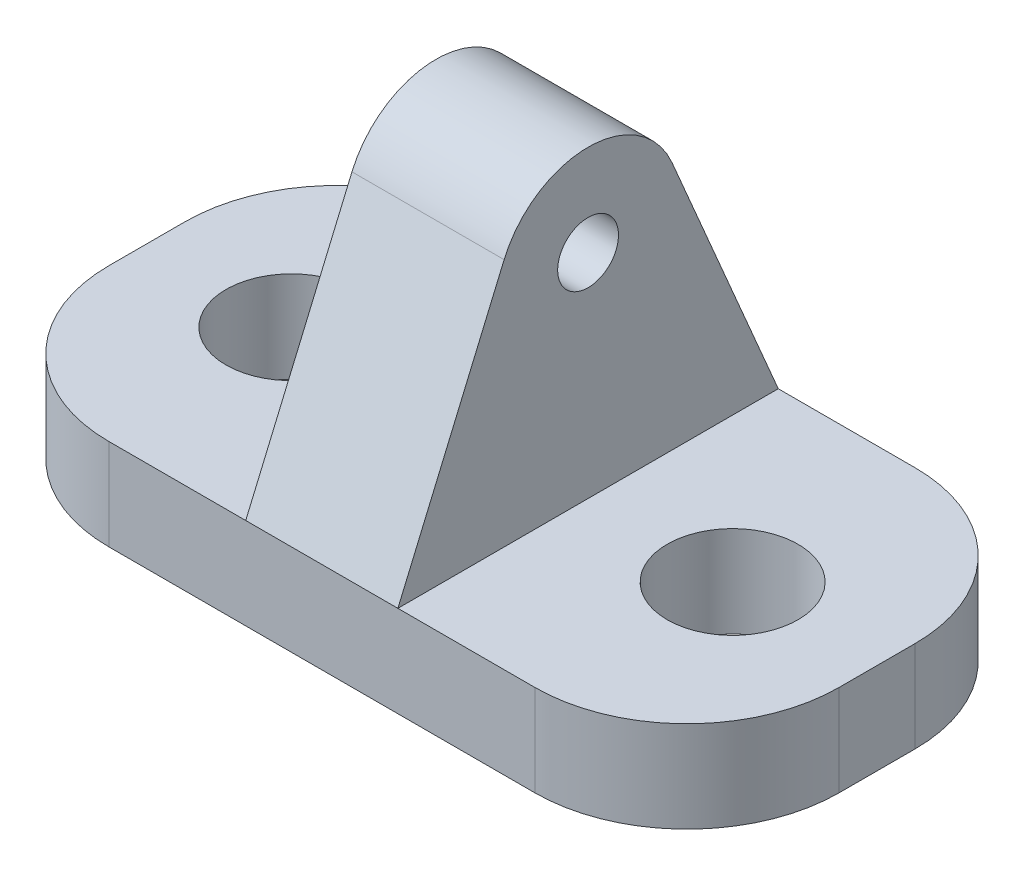
ISO-10303-21;
HEADER;
FILE_DESCRIPTION(('STEP AP214'),'2;1');
FILE_NAME('part.step','',(''),(''),'','','');
FILE_SCHEMA(('AUTOMOTIVE_DESIGN { 1 0 10303 214 1 1 1 1 }'));
ENDSEC;
DATA;
#1=APPLICATION_CONTEXT('core data for automotive mechanical design processes');
#2=APPLICATION_PROTOCOL_DEFINITION('international standard','automotive_design',2000,#1);
#3=PRODUCT_CONTEXT('',#1,'mechanical');
#4=PRODUCT('Part','Part','',(#3));
#5=PRODUCT_RELATED_PRODUCT_CATEGORY('part','',(#4));
#6=PRODUCT_DEFINITION_FORMATION('','',#4);
#7=PRODUCT_DEFINITION_CONTEXT('part definition',#1,'design');
#8=PRODUCT_DEFINITION('design','',#6,#7);
#9=PRODUCT_DEFINITION_SHAPE('','',#8);
#10=(LENGTH_UNIT() NAMED_UNIT(*) SI_UNIT(.MILLI.,.METRE.));
#11=(NAMED_UNIT(*) PLANE_ANGLE_UNIT() SI_UNIT($,.RADIAN.));
#12=(NAMED_UNIT(*) SI_UNIT($,.STERADIAN.) SOLID_ANGLE_UNIT());
#13=UNCERTAINTY_MEASURE_WITH_UNIT(LENGTH_MEASURE(1.E-05),#10,'distance_accuracy_value','');
#14=(GEOMETRIC_REPRESENTATION_CONTEXT(3) GLOBAL_UNCERTAINTY_ASSIGNED_CONTEXT((#13)) GLOBAL_UNIT_ASSIGNED_CONTEXT((#10,
#11,#12)) REPRESENTATION_CONTEXT('',''));
#15=CARTESIAN_POINT('',(0.,0.,0.));
#16=DIRECTION('',(0.,0.,1.));
#17=DIRECTION('',(1.,0.,0.));
#18=AXIS2_PLACEMENT_3D('',#15,#16,#17);
#19=CARTESIAN_POINT('',(-2.5,1.5,-17.430339887499));
#20=DIRECTION('',(-1.,0.,0.));
#21=DIRECTION('',(0.,0.,1.));
#22=AXIS2_PLACEMENT_3D('',#19,#20,#21);
#23=PLANE('',#22);
#24=CARTESIAN_POINT('',(-2.5,8.5,0.));
#25=DIRECTION('',(-1.,0.,0.));
#26=DIRECTION('',(0.,0.,1.));
#27=AXIS2_PLACEMENT_3D('',#24,#25,#26);
#28=CIRCLE('',#27,1.);
#29=CARTESIAN_POINT('',(-2.5,8.5,1.));
#30=VERTEX_POINT('',#29);
#31=EDGE_CURVE('E331',#30,#30,#28,.T.);
#32=ORIENTED_EDGE('',*,*,#31,.F.);
#33=EDGE_LOOP('',(#32));
#34=FACE_BOUND('',#33,.T.);
#35=CARTESIAN_POINT('',(-2.5,8.5,0.));
#36=DIRECTION('',(-1.,0.,0.));
#37=DIRECTION('',(0.,0.,1.));
#38=AXIS2_PLACEMENT_3D('',#35,#36,#37);
#39=CIRCLE('',#38,3.);
#40=CARTESIAN_POINT('',(-2.5,9.67779480948674,2.75913018662514));
#41=VERTEX_POINT('',#40);
#42=CARTESIAN_POINT('',(-2.5,9.67779480948674,-2.75913018662515));
#43=VERTEX_POINT('',#42);
#44=EDGE_CURVE('E286',#41,#43,#39,.T.);
#45=ORIENTED_EDGE('',*,*,#44,.T.);
#46=DIRECTION('',(0.,-0.919710062208382,-0.392598269828912));
#47=VECTOR('',#46,1.);
#48=CARTESIAN_POINT('',(-2.5,-2.53695888050529,-7.97326381648061));
#49=LINE('',#48,#47);
#50=CARTESIAN_POINT('',(-2.5,1.5,-6.25));
#51=VERTEX_POINT('',#50);
#52=EDGE_CURVE('E324',#43,#51,#49,.T.);
#53=ORIENTED_EDGE('',*,*,#52,.T.);
#54=DIRECTION('',(0.,0.,1.));
#55=VECTOR('',#54,1.);
#56=CARTESIAN_POINT('',(-2.5,1.5,-17.430339887499));
#57=LINE('',#56,#55);
#58=CARTESIAN_POINT('',(-2.5,1.5,6.25));
#59=VERTEX_POINT('',#58);
#60=EDGE_CURVE('E191',#51,#59,#57,.T.);
#61=ORIENTED_EDGE('',*,*,#60,.T.);
#62=DIRECTION('',(0.,0.919710062208381,-0.392598269828912));
#63=VECTOR('',#62,1.);
#64=CARTESIAN_POINT('',(-2.5,10.0504161200959,2.60006866511119));
#65=LINE('',#64,#63);
#66=EDGE_CURVE('E338',#59,#41,#65,.T.);
#67=ORIENTED_EDGE('',*,*,#66,.T.);
#68=EDGE_LOOP('',(#45,#53,#61,#67));
#69=FACE_BOUND('',#68,.T.);
#70=ADVANCED_FACE('F99',(#34,#69),#23,.T.);
#71=CARTESIAN_POINT('',(2.5,11.5,-17.430339887499));
#72=DIRECTION('',(1.,0.,0.));
#73=DIRECTION('',(0.,1.,0.));
#74=AXIS2_PLACEMENT_3D('',#71,#72,#73);
#75=PLANE('',#74);
#76=CARTESIAN_POINT('',(2.5,8.5,0.));
#77=DIRECTION('',(1.,0.,0.));
#78=DIRECTION('',(0.,1.,0.));
#79=AXIS2_PLACEMENT_3D('',#76,#77,#78);
#80=CIRCLE('',#79,1.);
#81=CARTESIAN_POINT('',(2.5,9.5,0.));
#82=VERTEX_POINT('',#81);
#83=EDGE_CURVE('E103',#82,#82,#80,.T.);
#84=ORIENTED_EDGE('',*,*,#83,.F.);
#85=EDGE_LOOP('',(#84));
#86=FACE_BOUND('',#85,.T.);
#87=DIRECTION('',(0.,0.919710062208382,0.392598269828912));
#88=VECTOR('',#87,1.);
#89=CARTESIAN_POINT('',(2.5,5.92170710476816,-4.3624980248081));
#90=LINE('',#89,#88);
#91=CARTESIAN_POINT('',(2.5,1.5,-6.25));
#92=VERTEX_POINT('',#91);
#93=CARTESIAN_POINT('',(2.5,9.67779480948674,-2.75913018662515));
#94=VERTEX_POINT('',#93);
#95=EDGE_CURVE('E319',#92,#94,#90,.T.);
#96=ORIENTED_EDGE('',*,*,#95,.T.);
#97=CARTESIAN_POINT('',(2.5,8.5,0.));
#98=DIRECTION('',(1.,0.,0.));
#99=DIRECTION('',(0.,1.,0.));
#100=AXIS2_PLACEMENT_3D('',#97,#98,#99);
#101=CIRCLE('',#100,3.);
#102=CARTESIAN_POINT('',(2.5,9.67779480948674,2.75913018662514));
#103=VERTEX_POINT('',#102);
#104=EDGE_CURVE('E12',#94,#103,#101,.T.);
#105=ORIENTED_EDGE('',*,*,#104,.T.);
#106=DIRECTION('',(0.,-0.919710062208381,0.392598269828912));
#107=VECTOR('',#106,1.);
#108=CARTESIAN_POINT('',(2.5,18.5090821053694,-1.01069712656132));
#109=LINE('',#108,#107);
#110=CARTESIAN_POINT('',(2.5,1.5,6.25));
#111=VERTEX_POINT('',#110);
#112=EDGE_CURVE('E109',#103,#111,#109,.T.);
#113=ORIENTED_EDGE('',*,*,#112,.T.);
#114=DIRECTION('',(0.,0.,1.));
#115=VECTOR('',#114,1.);
#116=CARTESIAN_POINT('',(2.5,1.5,-17.430339887499));
#117=LINE('',#116,#115);
#118=EDGE_CURVE('E273',#92,#111,#117,.T.);
#119=ORIENTED_EDGE('',*,*,#118,.F.);
#120=EDGE_LOOP('',(#96,#105,#113,#119));
#121=FACE_BOUND('',#120,.T.);
#122=ADVANCED_FACE('F271',(#86,#121),#75,.T.);
#123=CARTESIAN_POINT('',(-6.99999999999997,1.5,-6.25));
#124=DIRECTION('',(0.,0.,1.));
#125=DIRECTION('',(1.,0.,0.));
#126=AXIS2_PLACEMENT_3D('',#123,#124,#125);
#127=PLANE('',#126);
#128=DIRECTION('',(-1.,0.,0.));
#129=VECTOR('',#128,1.);
#130=CARTESIAN_POINT('',(12.,1.5,-6.25));
#131=LINE('',#130,#129);
#132=EDGE_CURVE('E312',#92,#51,#131,.T.);
#133=ORIENTED_EDGE('',*,*,#132,.F.);
#134=DIRECTION('',(-1.,0.,0.));
#135=VECTOR('',#134,1.);
#136=CARTESIAN_POINT('',(-6.99999999999997,1.5,-6.25));
#137=LINE('',#136,#135);
#138=CARTESIAN_POINT('',(6.99999999999997,1.5,-6.25));
#139=VERTEX_POINT('',#138);
#140=EDGE_CURVE('E195',#139,#92,#137,.T.);
#141=ORIENTED_EDGE('',*,*,#140,.F.);
#142=DIRECTION('',(0.,-1.,0.));
#143=VECTOR('',#142,1.);
#144=CARTESIAN_POINT('',(6.99999999999997,1.5,-6.25));
#145=LINE('',#144,#143);
#146=CARTESIAN_POINT('',(6.99999999999997,-1.5,-6.25));
#147=VERTEX_POINT('',#146);
#148=EDGE_CURVE('E207',#139,#147,#145,.T.);
#149=ORIENTED_EDGE('',*,*,#148,.T.);
#150=DIRECTION('',(-1.,0.,0.));
#151=VECTOR('',#150,1.);
#152=CARTESIAN_POINT('',(-6.99999999999997,-1.5,-6.25));
#153=LINE('',#152,#151);
#154=CARTESIAN_POINT('',(-6.99999999999997,-1.5,-6.25));
#155=VERTEX_POINT('',#154);
#156=EDGE_CURVE('E203',#147,#155,#153,.T.);
#157=ORIENTED_EDGE('',*,*,#156,.T.);
#158=DIRECTION('',(0.,-1.,0.));
#159=VECTOR('',#158,1.);
#160=CARTESIAN_POINT('',(-6.99999999999997,1.5,-6.25));
#161=LINE('',#160,#159);
#162=CARTESIAN_POINT('',(-6.99999999999997,1.5,-6.25));
#163=VERTEX_POINT('',#162);
#164=EDGE_CURVE('E199',#163,#155,#161,.T.);
#165=ORIENTED_EDGE('',*,*,#164,.F.);
#166=EDGE_CURVE('E183',#51,#163,#137,.T.);
#167=ORIENTED_EDGE('',*,*,#166,.F.);
#168=EDGE_LOOP('',(#133,#141,#149,#157,#165,#167));
#169=FACE_BOUND('',#168,.T.);
#170=ADVANCED_FACE('F200',(#169),#127,.F.);
#171=CARTESIAN_POINT('',(-6.99999999999997,1.5,6.25));
#172=DIRECTION('',(0.,0.,-1.));
#173=DIRECTION('',(-1.,0.,0.));
#174=AXIS2_PLACEMENT_3D('',#171,#172,#173);
#175=PLANE('',#174);
#176=DIRECTION('',(-1.,0.,0.));
#177=VECTOR('',#176,1.);
#178=CARTESIAN_POINT('',(12.,1.5,6.25));
#179=LINE('',#178,#177);
#180=EDGE_CURVE('E116',#111,#59,#179,.T.);
#181=ORIENTED_EDGE('',*,*,#180,.T.);
#182=DIRECTION('',(1.,0.,0.));
#183=VECTOR('',#182,1.);
#184=CARTESIAN_POINT('',(-6.99999999999997,1.5,6.25));
#185=LINE('',#184,#183);
#186=CARTESIAN_POINT('',(-6.99999999999997,1.5,6.25));
#187=VERTEX_POINT('',#186);
#188=EDGE_CURVE('E166',#187,#59,#185,.T.);
#189=ORIENTED_EDGE('',*,*,#188,.F.);
#190=DIRECTION('',(0.,-1.,0.));
#191=VECTOR('',#190,1.);
#192=CARTESIAN_POINT('',(-6.99999999999997,1.5,6.25));
#193=LINE('',#192,#191);
#194=CARTESIAN_POINT('',(-6.99999999999997,-1.5,6.25));
#195=VERTEX_POINT('',#194);
#196=EDGE_CURVE('E263',#187,#195,#193,.T.);
#197=ORIENTED_EDGE('',*,*,#196,.T.);
#198=DIRECTION('',(1.,0.,0.));
#199=VECTOR('',#198,1.);
#200=CARTESIAN_POINT('',(-6.99999999999997,-1.5,6.25));
#201=LINE('',#200,#199);
#202=CARTESIAN_POINT('',(6.99999999999996,-1.5,6.25));
#203=VERTEX_POINT('',#202);
#204=EDGE_CURVE('E224',#195,#203,#201,.T.);
#205=ORIENTED_EDGE('',*,*,#204,.T.);
#206=DIRECTION('',(0.,-1.,0.));
#207=VECTOR('',#206,1.);
#208=CARTESIAN_POINT('',(6.99999999999996,1.5,6.25));
#209=LINE('',#208,#207);
#210=CARTESIAN_POINT('',(6.99999999999996,1.5,6.25));
#211=VERTEX_POINT('',#210);
#212=EDGE_CURVE('E259',#211,#203,#209,.T.);
#213=ORIENTED_EDGE('',*,*,#212,.F.);
#214=EDGE_CURVE('E282',#111,#211,#185,.T.);
#215=ORIENTED_EDGE('',*,*,#214,.F.);
#216=EDGE_LOOP('',(#181,#189,#197,#205,#213,#215));
#217=FACE_BOUND('',#216,.T.);
#218=ADVANCED_FACE('F288',(#217),#175,.F.);
#219=CARTESIAN_POINT('',(-7.,1.5,1.25));
#220=DIRECTION('',(0.,-1.,0.));
#221=DIRECTION('',(0.,0.,-1.));
#222=AXIS2_PLACEMENT_3D('',#219,#220,#221);
#223=PLANE('',#222);
#224=CARTESIAN_POINT('',(-7.25,1.5,0.));
#225=DIRECTION('',(0.,1.,0.));
#226=DIRECTION('',(0.,0.,1.));
#227=AXIS2_PLACEMENT_3D('',#224,#225,#226);
#228=CIRCLE('',#227,2.15);
#229=CARTESIAN_POINT('',(-7.25,1.5,2.15));
#230=VERTEX_POINT('',#229);
#231=EDGE_CURVE('E225',#230,#230,#228,.T.);
#232=ORIENTED_EDGE('',*,*,#231,.F.);
#233=EDGE_LOOP('',(#232));
#234=FACE_BOUND('',#233,.T.);
#235=ORIENTED_EDGE('',*,*,#60,.F.);
#236=ORIENTED_EDGE('',*,*,#166,.T.);
#237=CARTESIAN_POINT('',(-7.,1.5,-1.25));
#238=DIRECTION('',(0.,1.,0.));
#239=DIRECTION('',(0.,0.,-1.));
#240=AXIS2_PLACEMENT_3D('',#237,#238,#239);
#241=CIRCLE('',#240,5.);
#242=CARTESIAN_POINT('',(-12.,1.5,-1.24999999999996));
#243=VERTEX_POINT('',#242);
#244=EDGE_CURVE('E187',#163,#243,#241,.T.);
#245=ORIENTED_EDGE('',*,*,#244,.T.);
#246=DIRECTION('',(0.,0.,1.));
#247=VECTOR('',#246,1.);
#248=CARTESIAN_POINT('',(-12.,1.5,1.24999999999996));
#249=LINE('',#248,#247);
#250=CARTESIAN_POINT('',(-12.,1.5,1.24999999999996));
#251=VERTEX_POINT('',#250);
#252=EDGE_CURVE('E125',#243,#251,#249,.T.);
#253=ORIENTED_EDGE('',*,*,#252,.T.);
#254=CARTESIAN_POINT('',(-7.,1.5,1.25));
#255=DIRECTION('',(0.,1.,0.));
#256=DIRECTION('',(0.,0.,-1.));
#257=AXIS2_PLACEMENT_3D('',#254,#255,#256);
#258=CIRCLE('',#257,5.);
#259=EDGE_CURVE('E244',#251,#187,#258,.T.);
#260=ORIENTED_EDGE('',*,*,#259,.T.);
#261=ORIENTED_EDGE('',*,*,#188,.T.);
#262=EDGE_LOOP('',(#235,#236,#245,#253,#260,#261));
#263=FACE_BOUND('',#262,.T.);
#264=ADVANCED_FACE('F185',(#234,#263),#223,.F.);
#265=ORIENTED_EDGE('',*,*,#140,.T.);
#266=ORIENTED_EDGE('',*,*,#118,.T.);
#267=ORIENTED_EDGE('',*,*,#214,.T.);
#268=CARTESIAN_POINT('',(7.,1.5,1.25));
#269=DIRECTION('',(0.,1.,0.));
#270=DIRECTION('',(0.,0.,1.));
#271=AXIS2_PLACEMENT_3D('',#268,#269,#270);
#272=CIRCLE('',#271,5.);
#273=CARTESIAN_POINT('',(12.,1.5,1.24999999999997));
#274=VERTEX_POINT('',#273);
#275=EDGE_CURVE('E295',#211,#274,#272,.T.);
#276=ORIENTED_EDGE('',*,*,#275,.T.);
#277=DIRECTION('',(0.,0.,-1.));
#278=VECTOR('',#277,1.);
#279=CARTESIAN_POINT('',(12.,1.5,1.24999999999996));
#280=LINE('',#279,#278);
#281=CARTESIAN_POINT('',(12.,1.5,-1.24999999999996));
#282=VERTEX_POINT('',#281);
#283=EDGE_CURVE('E301',#274,#282,#280,.T.);
#284=ORIENTED_EDGE('',*,*,#283,.T.);
#285=CARTESIAN_POINT('',(7.,1.5,-1.25));
#286=DIRECTION('',(0.,1.,0.));
#287=DIRECTION('',(0.,0.,-1.));
#288=AXIS2_PLACEMENT_3D('',#285,#286,#287);
#289=CIRCLE('',#288,5.);
#290=EDGE_CURVE('E196',#282,#139,#289,.T.);
#291=ORIENTED_EDGE('',*,*,#290,.T.);
#292=EDGE_LOOP('',(#265,#266,#267,#276,#284,#291));
#293=FACE_BOUND('',#292,.T.);
#294=CARTESIAN_POINT('',(7.25,1.5,0.));
#295=DIRECTION('',(0.,1.,0.));
#296=DIRECTION('',(0.,0.,1.));
#297=AXIS2_PLACEMENT_3D('',#294,#295,#296);
#298=CIRCLE('',#297,2.15);
#299=CARTESIAN_POINT('',(7.25,1.5,2.15));
#300=VERTEX_POINT('',#299);
#301=EDGE_CURVE('E350',#300,#300,#298,.T.);
#302=ORIENTED_EDGE('',*,*,#301,.F.);
#303=EDGE_LOOP('',(#302));
#304=FACE_BOUND('',#303,.T.);
#305=ADVANCED_FACE('F280',(#293,#304),#223,.F.);
#306=CARTESIAN_POINT('',(-7.,-1.5,1.25));
#307=DIRECTION('',(0.,-1.,0.));
#308=DIRECTION('',(0.,0.,-1.));
#309=AXIS2_PLACEMENT_3D('',#306,#307,#308);
#310=PLANE('',#309);
#311=CARTESIAN_POINT('',(-7.25,-1.5,0.));
#312=DIRECTION('',(0.,1.,0.));
#313=DIRECTION('',(0.,0.,1.));
#314=AXIS2_PLACEMENT_3D('',#311,#312,#313);
#315=CIRCLE('',#314,2.15);
#316=CARTESIAN_POINT('',(-7.25,-1.5,2.15));
#317=VERTEX_POINT('',#316);
#318=EDGE_CURVE('E354',#317,#317,#315,.T.);
#319=ORIENTED_EDGE('',*,*,#318,.T.);
#320=EDGE_LOOP('',(#319));
#321=FACE_BOUND('',#320,.T.);
#322=CARTESIAN_POINT('',(-7.,-1.5,1.25));
#323=DIRECTION('',(0.,1.,0.));
#324=DIRECTION('',(0.,0.,-1.));
#325=AXIS2_PLACEMENT_3D('',#322,#323,#324);
#326=CIRCLE('',#325,5.);
#327=CARTESIAN_POINT('',(-12.,-1.5,1.24999999999996));
#328=VERTEX_POINT('',#327);
#329=EDGE_CURVE('E220',#328,#195,#326,.T.);
#330=ORIENTED_EDGE('',*,*,#329,.F.);
#331=DIRECTION('',(0.,0.,1.));
#332=VECTOR('',#331,1.);
#333=CARTESIAN_POINT('',(-12.,-1.5,1.24999999999996));
#334=LINE('',#333,#332);
#335=CARTESIAN_POINT('',(-12.,-1.5,-1.24999999999996));
#336=VERTEX_POINT('',#335);
#337=EDGE_CURVE('E158',#336,#328,#334,.T.);
#338=ORIENTED_EDGE('',*,*,#337,.F.);
#339=CARTESIAN_POINT('',(-7.,-1.5,-1.25));
#340=DIRECTION('',(0.,1.,0.));
#341=DIRECTION('',(0.,0.,-1.));
#342=AXIS2_PLACEMENT_3D('',#339,#340,#341);
#343=CIRCLE('',#342,5.);
#344=EDGE_CURVE('E239',#155,#336,#343,.T.);
#345=ORIENTED_EDGE('',*,*,#344,.F.);
#346=ORIENTED_EDGE('',*,*,#156,.F.);
#347=CARTESIAN_POINT('',(7.,-1.5,-1.25));
#348=DIRECTION('',(0.,1.,0.));
#349=DIRECTION('',(0.,0.,-1.));
#350=AXIS2_PLACEMENT_3D('',#347,#348,#349);
#351=CIRCLE('',#350,5.);
#352=CARTESIAN_POINT('',(12.,-1.5,-1.24999999999996));
#353=VERTEX_POINT('',#352);
#354=EDGE_CURVE('E234',#353,#147,#351,.T.);
#355=ORIENTED_EDGE('',*,*,#354,.F.);
#356=DIRECTION('',(0.,0.,-1.));
#357=VECTOR('',#356,1.);
#358=CARTESIAN_POINT('',(12.,-1.5,1.24999999999996));
#359=LINE('',#358,#357);
#360=CARTESIAN_POINT('',(12.,-1.5,1.24999999999997));
#361=VERTEX_POINT('',#360);
#362=EDGE_CURVE('E231',#361,#353,#359,.T.);
#363=ORIENTED_EDGE('',*,*,#362,.F.);
#364=CARTESIAN_POINT('',(7.,-1.5,1.25));
#365=DIRECTION('',(0.,1.,0.));
#366=DIRECTION('',(0.,0.,1.));
#367=AXIS2_PLACEMENT_3D('',#364,#365,#366);
#368=CIRCLE('',#367,5.);
#369=EDGE_CURVE('E228',#203,#361,#368,.T.);
#370=ORIENTED_EDGE('',*,*,#369,.F.);
#371=ORIENTED_EDGE('',*,*,#204,.F.);
#372=EDGE_LOOP('',(#330,#338,#345,#346,#355,#363,#370,#371));
#373=FACE_BOUND('',#372,.T.);
#374=CARTESIAN_POINT('',(7.25,-1.5,0.));
#375=DIRECTION('',(0.,1.,0.));
#376=DIRECTION('',(0.,0.,1.));
#377=AXIS2_PLACEMENT_3D('',#374,#375,#376);
#378=CIRCLE('',#377,2.15);
#379=CARTESIAN_POINT('',(7.25,-1.5,2.15));
#380=VERTEX_POINT('',#379);
#381=EDGE_CURVE('E348',#380,#380,#378,.T.);
#382=ORIENTED_EDGE('',*,*,#381,.T.);
#383=EDGE_LOOP('',(#382));
#384=FACE_BOUND('',#383,.T.);
#385=ADVANCED_FACE('F364',(#321,#373,#384),#310,.T.);
#386=CARTESIAN_POINT('',(-7.,1.5,1.25));
#387=DIRECTION('',(0.,-1.,0.));
#388=DIRECTION('',(0.,0.,-1.));
#389=AXIS2_PLACEMENT_3D('',#386,#387,#388);
#390=CYLINDRICAL_SURFACE('',#389,5.);
#391=ORIENTED_EDGE('',*,*,#329,.T.);
#392=ORIENTED_EDGE('',*,*,#196,.F.);
#393=ORIENTED_EDGE('',*,*,#259,.F.);
#394=DIRECTION('',(0.,-1.,0.));
#395=VECTOR('',#394,1.);
#396=CARTESIAN_POINT('',(-12.,1.5,1.24999999999996));
#397=LINE('',#396,#395);
#398=EDGE_CURVE('E215',#251,#328,#397,.T.);
#399=ORIENTED_EDGE('',*,*,#398,.T.);
#400=EDGE_LOOP('',(#391,#392,#393,#399));
#401=FACE_BOUND('',#400,.T.);
#402=ADVANCED_FACE('F101',(#401),#390,.T.);
#403=CARTESIAN_POINT('',(7.,1.5,1.25));
#404=DIRECTION('',(0.,-1.,0.));
#405=DIRECTION('',(0.,0.,-1.));
#406=AXIS2_PLACEMENT_3D('',#403,#404,#405);
#407=CYLINDRICAL_SURFACE('',#406,5.);
#408=ORIENTED_EDGE('',*,*,#369,.T.);
#409=DIRECTION('',(0.,-1.,0.));
#410=VECTOR('',#409,1.);
#411=CARTESIAN_POINT('',(12.,1.5,1.24999999999997));
#412=LINE('',#411,#410);
#413=EDGE_CURVE('E255',#274,#361,#412,.T.);
#414=ORIENTED_EDGE('',*,*,#413,.F.);
#415=ORIENTED_EDGE('',*,*,#275,.F.);
#416=ORIENTED_EDGE('',*,*,#212,.T.);
#417=EDGE_LOOP('',(#408,#414,#415,#416));
#418=FACE_BOUND('',#417,.T.);
#419=ADVANCED_FACE('F487',(#418),#407,.T.);
#420=CARTESIAN_POINT('',(12.,1.5,1.24999999999996));
#421=DIRECTION('',(-1.,0.,0.));
#422=DIRECTION('',(0.,0.,1.));
#423=AXIS2_PLACEMENT_3D('',#420,#421,#422);
#424=PLANE('',#423);
#425=ORIENTED_EDGE('',*,*,#362,.T.);
#426=DIRECTION('',(0.,-1.,0.));
#427=VECTOR('',#426,1.);
#428=CARTESIAN_POINT('',(12.,1.5,-1.24999999999996));
#429=LINE('',#428,#427);
#430=EDGE_CURVE('E251',#282,#353,#429,.T.);
#431=ORIENTED_EDGE('',*,*,#430,.F.);
#432=ORIENTED_EDGE('',*,*,#283,.F.);
#433=ORIENTED_EDGE('',*,*,#413,.T.);
#434=EDGE_LOOP('',(#425,#431,#432,#433));
#435=FACE_BOUND('',#434,.T.);
#436=ADVANCED_FACE('F494',(#435),#424,.F.);
#437=CARTESIAN_POINT('',(7.,1.5,-1.25));
#438=DIRECTION('',(0.,-1.,0.));
#439=DIRECTION('',(0.,0.,-1.));
#440=AXIS2_PLACEMENT_3D('',#437,#438,#439);
#441=CYLINDRICAL_SURFACE('',#440,5.);
#442=ORIENTED_EDGE('',*,*,#354,.T.);
#443=ORIENTED_EDGE('',*,*,#148,.F.);
#444=ORIENTED_EDGE('',*,*,#290,.F.);
#445=ORIENTED_EDGE('',*,*,#430,.T.);
#446=EDGE_LOOP('',(#442,#443,#444,#445));
#447=FACE_BOUND('',#446,.T.);
#448=ADVANCED_FACE('F309',(#447),#441,.T.);
#449=CARTESIAN_POINT('',(-7.,1.5,-1.25));
#450=DIRECTION('',(0.,-1.,0.));
#451=DIRECTION('',(0.,0.,-1.));
#452=AXIS2_PLACEMENT_3D('',#449,#450,#451);
#453=CYLINDRICAL_SURFACE('',#452,5.);
#454=ORIENTED_EDGE('',*,*,#344,.T.);
#455=DIRECTION('',(0.,-1.,0.));
#456=VECTOR('',#455,1.);
#457=CARTESIAN_POINT('',(-12.,1.5,-1.24999999999996));
#458=LINE('',#457,#456);
#459=EDGE_CURVE('E208',#243,#336,#458,.T.);
#460=ORIENTED_EDGE('',*,*,#459,.F.);
#461=ORIENTED_EDGE('',*,*,#244,.F.);
#462=ORIENTED_EDGE('',*,*,#164,.T.);
#463=EDGE_LOOP('',(#454,#460,#461,#462));
#464=FACE_BOUND('',#463,.T.);
#465=ADVANCED_FACE('F210',(#464),#453,.T.);
#466=CARTESIAN_POINT('',(-12.,1.5,1.24999999999996));
#467=DIRECTION('',(1.,0.,0.));
#468=DIRECTION('',(0.,0.,-1.));
#469=AXIS2_PLACEMENT_3D('',#466,#467,#468);
#470=PLANE('',#469);
#471=ORIENTED_EDGE('',*,*,#337,.T.);
#472=ORIENTED_EDGE('',*,*,#398,.F.);
#473=ORIENTED_EDGE('',*,*,#252,.F.);
#474=ORIENTED_EDGE('',*,*,#459,.T.);
#475=EDGE_LOOP('',(#471,#472,#473,#474));
#476=FACE_BOUND('',#475,.T.);
#477=ADVANCED_FACE('F370',(#476),#470,.F.);
#478=CARTESIAN_POINT('',(-7.25,1.5,0.));
#479=DIRECTION('',(0.,-1.,0.));
#480=DIRECTION('',(0.,0.,-1.));
#481=AXIS2_PLACEMENT_3D('',#478,#479,#480);
#482=CYLINDRICAL_SURFACE('',#481,2.15);
#483=ORIENTED_EDGE('',*,*,#231,.T.);
#484=EDGE_LOOP('',(#483));
#485=FACE_BOUND('',#484,.T.);
#486=ORIENTED_EDGE('',*,*,#318,.F.);
#487=EDGE_LOOP('',(#486));
#488=FACE_BOUND('',#487,.T.);
#489=ADVANCED_FACE('F367',(#485,#488),#482,.F.);
#490=CARTESIAN_POINT('',(7.25,1.5,0.));
#491=DIRECTION('',(0.,-1.,0.));
#492=DIRECTION('',(0.,0.,-1.));
#493=AXIS2_PLACEMENT_3D('',#490,#491,#492);
#494=CYLINDRICAL_SURFACE('',#493,2.15);
#495=ORIENTED_EDGE('',*,*,#301,.T.);
#496=EDGE_LOOP('',(#495));
#497=FACE_BOUND('',#496,.T.);
#498=ORIENTED_EDGE('',*,*,#381,.F.);
#499=EDGE_LOOP('',(#498));
#500=FACE_BOUND('',#499,.T.);
#501=ADVANCED_FACE('F369',(#497,#500),#494,.F.);
#502=CARTESIAN_POINT('',(12.,8.5,0.));
#503=DIRECTION('',(-1.,0.,0.));
#504=DIRECTION('',(0.,-1.,0.));
#505=AXIS2_PLACEMENT_3D('',#502,#503,#504);
#506=CYLINDRICAL_SURFACE('',#505,3.);
#507=DIRECTION('',(-1.,0.,0.));
#508=VECTOR('',#507,1.);
#509=CARTESIAN_POINT('',(12.,9.67779480948674,2.75913018662514));
#510=LINE('',#509,#508);
#511=EDGE_CURVE('E335',#103,#41,#510,.T.);
#512=ORIENTED_EDGE('',*,*,#511,.F.);
#513=ORIENTED_EDGE('',*,*,#104,.F.);
#514=DIRECTION('',(-1.,0.,0.));
#515=VECTOR('',#514,1.);
#516=CARTESIAN_POINT('',(12.,9.67779480948674,-2.75913018662515));
#517=LINE('',#516,#515);
#518=EDGE_CURVE('E320',#94,#43,#517,.T.);
#519=ORIENTED_EDGE('',*,*,#518,.T.);
#520=ORIENTED_EDGE('',*,*,#44,.F.);
#521=EDGE_LOOP('',(#512,#513,#519,#520));
#522=FACE_BOUND('',#521,.T.);
#523=ADVANCED_FACE('F377',(#522),#506,.T.);
#524=CARTESIAN_POINT('',(12.,2.48792872200431,5.82828110954678));
#525=DIRECTION('',(0.,0.392598269828912,0.919710062208381));
#526=DIRECTION('',(0.,-0.919710062208381,0.392598269828912));
#527=AXIS2_PLACEMENT_3D('',#524,#525,#526);
#528=PLANE('',#527);
#529=ORIENTED_EDGE('',*,*,#180,.F.);
#530=ORIENTED_EDGE('',*,*,#112,.F.);
#531=ORIENTED_EDGE('',*,*,#511,.T.);
#532=ORIENTED_EDGE('',*,*,#66,.F.);
#533=EDGE_LOOP('',(#529,#530,#531,#532));
#534=FACE_BOUND('',#533,.T.);
#535=ADVANCED_FACE('F380',(#534),#528,.T.);
#536=CARTESIAN_POINT('',(12.,2.4879287220043,-5.82828110954678));
#537=DIRECTION('',(0.,0.392598269828912,-0.919710062208381));
#538=DIRECTION('',(0.,0.919710062208382,0.392598269828912));
#539=AXIS2_PLACEMENT_3D('',#536,#537,#538);
#540=PLANE('',#539);
#541=ORIENTED_EDGE('',*,*,#518,.F.);
#542=ORIENTED_EDGE('',*,*,#95,.F.);
#543=ORIENTED_EDGE('',*,*,#132,.T.);
#544=ORIENTED_EDGE('',*,*,#52,.F.);
#545=EDGE_LOOP('',(#541,#542,#543,#544));
#546=FACE_BOUND('',#545,.T.);
#547=ADVANCED_FACE('F397',(#546),#540,.T.);
#548=CARTESIAN_POINT('',(12.,8.5,0.));
#549=DIRECTION('',(-1.,0.,0.));
#550=DIRECTION('',(0.,-1.,0.));
#551=AXIS2_PLACEMENT_3D('',#548,#549,#550);
#552=CYLINDRICAL_SURFACE('',#551,1.);
#553=ORIENTED_EDGE('',*,*,#31,.T.);
#554=EDGE_LOOP('',(#553));
#555=FACE_BOUND('',#554,.T.);
#556=ORIENTED_EDGE('',*,*,#83,.T.);
#557=EDGE_LOOP('',(#556));
#558=FACE_BOUND('',#557,.T.);
#559=ADVANCED_FACE('F402',(#555,#558),#552,.F.);
#560=CLOSED_SHELL('',(#70,#122,#170,#218,#264,#305,#385,#402,#419,#436,#448,#465,#477,#489,#501,
#523,#535,#547,#559));
#561=MANIFOLD_SOLID_BREP('B2',#560);
#562=ADVANCED_BREP_SHAPE_REPRESENTATION('',(#18,#561),#14);
#563=SHAPE_DEFINITION_REPRESENTATION(#9,#562);
ENDSEC;
END-ISO-10303-21;
